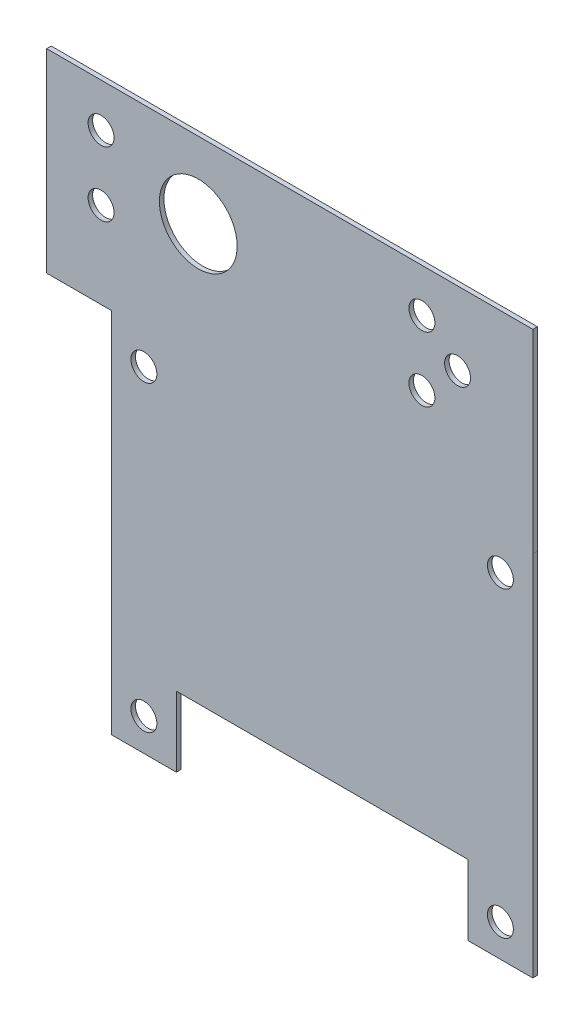
ISO-10303-21;
HEADER;
FILE_DESCRIPTION(('STEP AP214'),'2;1');
FILE_NAME('part.step','',(''),(''),'','','');
FILE_SCHEMA(('AUTOMOTIVE_DESIGN { 1 0 10303 214 1 1 1 1 }'));
ENDSEC;
DATA;
#1=APPLICATION_CONTEXT('core data for automotive mechanical design processes');
#2=APPLICATION_PROTOCOL_DEFINITION('international standard','automotive_design',2000,#1);
#3=PRODUCT_CONTEXT('',#1,'mechanical');
#4=PRODUCT('Part','Part','',(#3));
#5=PRODUCT_RELATED_PRODUCT_CATEGORY('part','',(#4));
#6=PRODUCT_DEFINITION_FORMATION('','',#4);
#7=PRODUCT_DEFINITION_CONTEXT('part definition',#1,'design');
#8=PRODUCT_DEFINITION('design','',#6,#7);
#9=PRODUCT_DEFINITION_SHAPE('','',#8);
#10=(LENGTH_UNIT() NAMED_UNIT(*) SI_UNIT(.MILLI.,.METRE.));
#11=(NAMED_UNIT(*) PLANE_ANGLE_UNIT() SI_UNIT($,.RADIAN.));
#12=(NAMED_UNIT(*) SI_UNIT($,.STERADIAN.) SOLID_ANGLE_UNIT());
#13=UNCERTAINTY_MEASURE_WITH_UNIT(LENGTH_MEASURE(1.E-05),#10,'distance_accuracy_value','');
#14=(GEOMETRIC_REPRESENTATION_CONTEXT(3) GLOBAL_UNCERTAINTY_ASSIGNED_CONTEXT((#13)) GLOBAL_UNIT_ASSIGNED_CONTEXT((#10,
#11,#12)) REPRESENTATION_CONTEXT('',''));
#15=CARTESIAN_POINT('',(0.,0.,0.));
#16=DIRECTION('',(0.,0.,1.));
#17=DIRECTION('',(1.,0.,0.));
#18=AXIS2_PLACEMENT_3D('',#15,#16,#17);
#19=CARTESIAN_POINT('',(-32.5,-17.5,-0.7));
#20=DIRECTION('',(0.,-1.,0.));
#21=DIRECTION('',(1.,0.,0.));
#22=AXIS2_PLACEMENT_3D('',#19,#20,#21);
#23=PLANE('',#22);
#24=DIRECTION('',(1.,0.,0.));
#25=VECTOR('',#24,1.);
#26=CARTESIAN_POINT('',(-32.5,-17.5,0.));
#27=LINE('',#26,#25);
#28=CARTESIAN_POINT('',(-22.5,-17.5,0.));
#29=VERTEX_POINT('',#28);
#30=CARTESIAN_POINT('',(22.5,-17.5,0.));
#31=VERTEX_POINT('',#30);
#32=EDGE_CURVE('E173',#29,#31,#27,.T.);
#33=ORIENTED_EDGE('',*,*,#32,.F.);
#34=DIRECTION('',(0.,0.,-1.));
#35=VECTOR('',#34,1.);
#36=CARTESIAN_POINT('',(-22.5,-17.5,0.));
#37=LINE('',#36,#35);
#38=CARTESIAN_POINT('',(-22.5,-17.5,-0.7));
#39=VERTEX_POINT('',#38);
#40=EDGE_CURVE('E467',#29,#39,#37,.T.);
#41=ORIENTED_EDGE('',*,*,#40,.T.);
#42=DIRECTION('',(1.,0.,0.));
#43=VECTOR('',#42,1.);
#44=CARTESIAN_POINT('',(-32.5,-17.5,-0.7));
#45=LINE('',#44,#43);
#46=CARTESIAN_POINT('',(22.5,-17.5,-0.700000000000002));
#47=VERTEX_POINT('',#46);
#48=EDGE_CURVE('E286',#39,#47,#45,.T.);
#49=ORIENTED_EDGE('',*,*,#48,.T.);
#50=DIRECTION('',(0.,0.,-1.));
#51=VECTOR('',#50,1.);
#52=CARTESIAN_POINT('',(22.5,-17.5,0.));
#53=LINE('',#52,#51);
#54=EDGE_CURVE('E471',#31,#47,#53,.T.);
#55=ORIENTED_EDGE('',*,*,#54,.F.);
#56=EDGE_LOOP('',(#33,#41,#49,#55));
#57=FACE_BOUND('',#56,.T.);
#58=ADVANCED_FACE('F151',(#57),#23,.T.);
#59=CARTESIAN_POINT('',(-32.5,17.5,-0.7));
#60=DIRECTION('',(-1.,0.,0.));
#61=DIRECTION('',(0.,0.,1.));
#62=AXIS2_PLACEMENT_3D('',#59,#60,#61);
#63=PLANE('',#62);
#64=DIRECTION('',(0.,-1.,0.));
#65=VECTOR('',#64,1.);
#66=CARTESIAN_POINT('',(-32.5,17.5,0.));
#67=LINE('',#66,#65);
#68=CARTESIAN_POINT('',(-32.5,28.3351768777757,0.));
#69=VERTEX_POINT('',#68);
#70=CARTESIAN_POINT('',(-32.5,-28.3351768777757,0.));
#71=VERTEX_POINT('',#70);
#72=EDGE_CURVE('E276',#69,#71,#67,.T.);
#73=ORIENTED_EDGE('',*,*,#72,.F.);
#74=DIRECTION('',(0.,0.,1.));
#75=VECTOR('',#74,1.);
#76=CARTESIAN_POINT('',(-32.5,28.3351768777757,-0.700000000000062));
#77=LINE('',#76,#75);
#78=CARTESIAN_POINT('',(-32.5,28.3351768777757,-0.700000000000062));
#79=VERTEX_POINT('',#78);
#80=EDGE_CURVE('E279',#79,#69,#77,.T.);
#81=ORIENTED_EDGE('',*,*,#80,.F.);
#82=DIRECTION('',(0.,-1.,0.));
#83=VECTOR('',#82,1.);
#84=CARTESIAN_POINT('',(-32.5,17.5,-0.7));
#85=LINE('',#84,#83);
#86=CARTESIAN_POINT('',(-32.5,-28.3351768777757,-0.700000000000062));
#87=VERTEX_POINT('',#86);
#88=EDGE_CURVE('E465',#79,#87,#85,.T.);
#89=ORIENTED_EDGE('',*,*,#88,.T.);
#90=DIRECTION('',(0.,0.,1.));
#91=VECTOR('',#90,1.);
#92=CARTESIAN_POINT('',(-32.5,-28.3351768777757,-0.700000000000062));
#93=LINE('',#92,#91);
#94=EDGE_CURVE('E282',#87,#71,#93,.T.);
#95=ORIENTED_EDGE('',*,*,#94,.T.);
#96=EDGE_LOOP('',(#73,#81,#89,#95));
#97=FACE_BOUND('',#96,.T.);
#98=ADVANCED_FACE('F278',(#97),#63,.T.);
#99=CARTESIAN_POINT('',(32.5,17.5,-0.7));
#100=DIRECTION('',(-1.,0.,0.));
#101=DIRECTION('',(0.,0.,1.));
#102=AXIS2_PLACEMENT_3D('',#99,#100,#101);
#103=PLANE('',#102);
#104=DIRECTION('',(0.,-1.,0.));
#105=VECTOR('',#104,1.);
#106=CARTESIAN_POINT('',(32.5,17.5,0.));
#107=LINE('',#106,#105);
#108=CARTESIAN_POINT('',(32.5,28.3351768777757,0.));
#109=VERTEX_POINT('',#108);
#110=CARTESIAN_POINT('',(32.5,-28.3351768777757,0.));
#111=VERTEX_POINT('',#110);
#112=EDGE_CURVE('E287',#109,#111,#107,.T.);
#113=ORIENTED_EDGE('',*,*,#112,.T.);
#114=DIRECTION('',(0.,0.,1.));
#115=VECTOR('',#114,1.);
#116=CARTESIAN_POINT('',(32.5,-28.3351768777757,-0.700000000000062));
#117=LINE('',#116,#115);
#118=CARTESIAN_POINT('',(32.5,-28.3351768777757,-0.700000000000062));
#119=VERTEX_POINT('',#118);
#120=EDGE_CURVE('E346',#119,#111,#117,.T.);
#121=ORIENTED_EDGE('',*,*,#120,.F.);
#122=DIRECTION('',(0.,-1.,0.));
#123=VECTOR('',#122,1.);
#124=CARTESIAN_POINT('',(32.5,17.5,-0.7));
#125=LINE('',#124,#123);
#126=CARTESIAN_POINT('',(32.5,28.3351768777757,-0.700000000000062));
#127=VERTEX_POINT('',#126);
#128=EDGE_CURVE('E463',#127,#119,#125,.T.);
#129=ORIENTED_EDGE('',*,*,#128,.F.);
#130=DIRECTION('',(0.,0.,1.));
#131=VECTOR('',#130,1.);
#132=CARTESIAN_POINT('',(32.5,28.3351768777757,-0.700000000000062));
#133=LINE('',#132,#131);
#134=EDGE_CURVE('E311',#127,#109,#133,.T.);
#135=ORIENTED_EDGE('',*,*,#134,.T.);
#136=EDGE_LOOP('',(#113,#121,#129,#135));
#137=FACE_BOUND('',#136,.T.);
#138=ADVANCED_FACE('F531',(#137),#103,.F.);
#139=CARTESIAN_POINT('',(0.,0.,-0.7));
#140=DIRECTION('',(0.,0.,-1.));
#141=DIRECTION('',(-1.,0.,0.));
#142=AXIS2_PLACEMENT_3D('',#139,#140,#141);
#143=PLANE('',#142);
#144=ORIENTED_EDGE('',*,*,#48,.F.);
#145=DIRECTION('',(0.,1.,0.));
#146=VECTOR('',#145,1.);
#147=CARTESIAN_POINT('',(-22.5,-18.1675884388878,-0.7));
#148=LINE('',#147,#146);
#149=CARTESIAN_POINT('',(-22.5,-28.3351768777757,-0.700000000000062));
#150=VERTEX_POINT('',#149);
#151=EDGE_CURVE('E372',#39,#150,#148,.F.);
#152=ORIENTED_EDGE('',*,*,#151,.T.);
#153=DIRECTION('',(-1.,0.,0.));
#154=VECTOR('',#153,1.);
#155=CARTESIAN_POINT('',(-22.5,-28.3351768777757,-0.700000000000062));
#156=LINE('',#155,#154);
#157=EDGE_CURVE('E354',#87,#150,#156,.F.);
#158=ORIENTED_EDGE('',*,*,#157,.F.);
#159=ORIENTED_EDGE('',*,*,#88,.F.);
#160=DIRECTION('',(1.,0.,0.));
#161=VECTOR('',#160,1.);
#162=CARTESIAN_POINT('',(0.,28.3351768777757,-0.700000000000062));
#163=LINE('',#162,#161);
#164=CARTESIAN_POINT('',(-22.5,28.3351768777757,-0.700000000000062));
#165=VERTEX_POINT('',#164);
#166=EDGE_CURVE('E296',#79,#165,#163,.T.);
#167=ORIENTED_EDGE('',*,*,#166,.T.);
#168=DIRECTION('',(0.,1.,0.));
#169=VECTOR('',#168,1.);
#170=CARTESIAN_POINT('',(-22.5,18.1675884388878,-0.7));
#171=LINE('',#170,#169);
#172=CARTESIAN_POINT('',(-22.5,17.5,-0.7));
#173=VERTEX_POINT('',#172);
#174=EDGE_CURVE('E305',#165,#173,#171,.F.);
#175=ORIENTED_EDGE('',*,*,#174,.T.);
#176=DIRECTION('',(0.,1.,0.));
#177=VECTOR('',#176,1.);
#178=CARTESIAN_POINT('',(-22.5,18.1675884388878,-0.7));
#179=LINE('',#178,#177);
#180=CARTESIAN_POINT('',(-22.5,28.3351768777757,-0.699999999999937));
#181=VERTEX_POINT('',#180);
#182=EDGE_CURVE('E454',#173,#181,#179,.T.);
#183=ORIENTED_EDGE('',*,*,#182,.T.);
#184=DIRECTION('',(1.,0.,0.));
#185=VECTOR('',#184,1.);
#186=CARTESIAN_POINT('',(-22.5,28.3351768777757,-0.699999999999937));
#187=LINE('',#186,#185);
#188=CARTESIAN_POINT('',(-42.5,28.3351768777757,-0.699999999999937));
#189=VERTEX_POINT('',#188);
#190=EDGE_CURVE('E422',#189,#181,#187,.T.);
#191=ORIENTED_EDGE('',*,*,#190,.F.);
#192=DIRECTION('',(0.,-1.,0.));
#193=VECTOR('',#192,1.);
#194=CARTESIAN_POINT('',(-42.5,58.3351768777757,-0.699999999999729));
#195=LINE('',#194,#193);
#196=CARTESIAN_POINT('',(-42.5,58.3351768777757,-0.699999999999729));
#197=VERTEX_POINT('',#196);
#198=EDGE_CURVE('E427',#197,#189,#195,.T.);
#199=ORIENTED_EDGE('',*,*,#198,.F.);
#200=DIRECTION('',(1.,0.,0.));
#201=VECTOR('',#200,1.);
#202=CARTESIAN_POINT('',(-22.5,58.3351768777757,-0.699999999999729));
#203=LINE('',#202,#201);
#204=CARTESIAN_POINT('',(32.5,58.3351768777757,-0.699999999999729));
#205=VERTEX_POINT('',#204);
#206=EDGE_CURVE('E436',#205,#197,#203,.F.);
#207=ORIENTED_EDGE('',*,*,#206,.F.);
#208=DIRECTION('',(0.,-1.,0.));
#209=VECTOR('',#208,1.);
#210=CARTESIAN_POINT('',(32.5,58.3351768777757,-0.699999999999729));
#211=LINE('',#210,#209);
#212=CARTESIAN_POINT('',(32.5,28.3351768777757,-0.699999999999937));
#213=VERTEX_POINT('',#212);
#214=EDGE_CURVE('E398',#205,#213,#211,.T.);
#215=ORIENTED_EDGE('',*,*,#214,.T.);
#216=DIRECTION('',(-1.,0.,0.));
#217=VECTOR('',#216,1.);
#218=CARTESIAN_POINT('',(22.5,28.3351768777757,-0.699999999999937));
#219=LINE('',#218,#217);
#220=CARTESIAN_POINT('',(22.5,28.3351768777757,-0.699999999999937));
#221=VERTEX_POINT('',#220);
#222=EDGE_CURVE('E395',#213,#221,#219,.T.);
#223=ORIENTED_EDGE('',*,*,#222,.T.);
#224=DIRECTION('',(0.,1.,0.));
#225=VECTOR('',#224,1.);
#226=CARTESIAN_POINT('',(22.5,18.1675884388878,-0.7));
#227=LINE('',#226,#225);
#228=CARTESIAN_POINT('',(22.5,17.5,-0.700000000000002));
#229=VERTEX_POINT('',#228);
#230=EDGE_CURVE('E456',#221,#229,#227,.F.);
#231=ORIENTED_EDGE('',*,*,#230,.T.);
#232=DIRECTION('',(0.,1.,0.));
#233=VECTOR('',#232,1.);
#234=CARTESIAN_POINT('',(22.5,18.1675884388878,-0.700000000000002));
#235=LINE('',#234,#233);
#236=CARTESIAN_POINT('',(22.5,28.3351768777757,-0.700000000000062));
#237=VERTEX_POINT('',#236);
#238=EDGE_CURVE('E329',#229,#237,#235,.T.);
#239=ORIENTED_EDGE('',*,*,#238,.T.);
#240=DIRECTION('',(1.,0.,0.));
#241=VECTOR('',#240,1.);
#242=CARTESIAN_POINT('',(22.5,28.3351768777757,-0.700000000000062));
#243=LINE('',#242,#241);
#244=EDGE_CURVE('E308',#127,#237,#243,.F.);
#245=ORIENTED_EDGE('',*,*,#244,.F.);
#246=ORIENTED_EDGE('',*,*,#128,.T.);
#247=DIRECTION('',(-1.,0.,0.));
#248=VECTOR('',#247,1.);
#249=CARTESIAN_POINT('',(0.,-28.3351768777757,-0.700000000000062));
#250=LINE('',#249,#248);
#251=CARTESIAN_POINT('',(22.5,-28.3351768777757,-0.700000000000062));
#252=VERTEX_POINT('',#251);
#253=EDGE_CURVE('E337',#119,#252,#250,.T.);
#254=ORIENTED_EDGE('',*,*,#253,.T.);
#255=DIRECTION('',(0.,1.,0.));
#256=VECTOR('',#255,1.);
#257=CARTESIAN_POINT('',(22.5,-18.1675884388878,-0.700000000000002));
#258=LINE('',#257,#256);
#259=EDGE_CURVE('E351',#252,#47,#258,.T.);
#260=ORIENTED_EDGE('',*,*,#259,.T.);
#261=EDGE_LOOP('',(#144,#152,#158,#159,#167,#175,#183,#191,#199,#207,#215,#223,#231,#239,#245,
#246,#254,#260));
#262=FACE_BOUND('',#261,.T.);
#263=CARTESIAN_POINT('',(20.8904963417452,47.0054323524082,-0.699999999999808));
#264=DIRECTION('',(0.,0.,-1.));
#265=DIRECTION('',(0.,1.,0.));
#266=AXIS2_PLACEMENT_3D('',#263,#264,#265);
#267=CIRCLE('',#266,2.);
#268=CARTESIAN_POINT('',(20.8904963417452,45.0054323524082,-0.699999999999823));
#269=VERTEX_POINT('',#268);
#270=EDGE_CURVE('E404',#269,#269,#267,.F.);
#271=ORIENTED_EDGE('',*,*,#270,.T.);
#272=EDGE_LOOP('',(#271));
#273=FACE_BOUND('',#272,.T.);
#274=CARTESIAN_POINT('',(15.392410617428,51.6141033474119,-0.699999999999777));
#275=DIRECTION('',(0.,0.,-1.));
#276=DIRECTION('',(0.,1.,0.));
#277=AXIS2_PLACEMENT_3D('',#274,#275,#276);
#278=CIRCLE('',#277,2.);
#279=CARTESIAN_POINT('',(15.392410617428,53.6141033474119,-0.699999999999763));
#280=VERTEX_POINT('',#279);
#281=EDGE_CURVE('E410',#280,#280,#278,.T.);
#282=ORIENTED_EDGE('',*,*,#281,.F.);
#283=EDGE_LOOP('',(#282));
#284=FACE_BOUND('',#283,.T.);
#285=CARTESIAN_POINT('',(-34.107589382572,51.6141033474119,-0.699999999999777));
#286=DIRECTION('',(0.,0.,-1.));
#287=DIRECTION('',(0.,1.,0.));
#288=AXIS2_PLACEMENT_3D('',#285,#286,#287);
#289=CIRCLE('',#288,2.);
#290=CARTESIAN_POINT('',(-34.107589382572,53.6141033474119,-0.699999999999763));
#291=VERTEX_POINT('',#290);
#292=EDGE_CURVE('E413',#291,#291,#289,.T.);
#293=ORIENTED_EDGE('',*,*,#292,.F.);
#294=EDGE_LOOP('',(#293));
#295=FACE_BOUND('',#294,.T.);
#296=CARTESIAN_POINT('',(-19.107589382572,46.6141033474119,-0.699999999999812));
#297=DIRECTION('',(0.,0.,-1.));
#298=DIRECTION('',(0.,1.,0.));
#299=AXIS2_PLACEMENT_3D('',#296,#297,#298);
#300=CIRCLE('',#299,6.);
#301=CARTESIAN_POINT('',(-19.107589382572,52.6141033474119,-0.69999999999977));
#302=VERTEX_POINT('',#301);
#303=EDGE_CURVE('E401',#302,#302,#300,.F.);
#304=ORIENTED_EDGE('',*,*,#303,.T.);
#305=EDGE_LOOP('',(#304));
#306=FACE_BOUND('',#305,.T.);
#307=CARTESIAN_POINT('',(15.392410617428,41.6141033474119,-0.699999999999847));
#308=DIRECTION('',(0.,0.,-1.));
#309=DIRECTION('',(0.,1.,0.));
#310=AXIS2_PLACEMENT_3D('',#307,#308,#309);
#311=CIRCLE('',#310,2.00000000000001);
#312=CARTESIAN_POINT('',(15.392410617428,43.6141033474119,-0.699999999999833));
#313=VERTEX_POINT('',#312);
#314=EDGE_CURVE('E392',#313,#313,#311,.F.);
#315=ORIENTED_EDGE('',*,*,#314,.T.);
#316=EDGE_LOOP('',(#315));
#317=FACE_BOUND('',#316,.T.);
#318=CARTESIAN_POINT('',(-34.107589382572,41.6141033474119,-0.699999999999847));
#319=DIRECTION('',(0.,0.,-1.));
#320=DIRECTION('',(0.,1.,0.));
#321=AXIS2_PLACEMENT_3D('',#318,#319,#320);
#322=CIRCLE('',#321,2.);
#323=CARTESIAN_POINT('',(-34.107589382572,43.6141033474119,-0.699999999999833));
#324=VERTEX_POINT('',#323);
#325=EDGE_CURVE('E389',#324,#324,#322,.F.);
#326=ORIENTED_EDGE('',*,*,#325,.T.);
#327=EDGE_LOOP('',(#326));
#328=FACE_BOUND('',#327,.T.);
#329=CARTESIAN_POINT('',(-27.5,-23.3351768777757,-0.700000000000027));
#330=DIRECTION('',(0.,0.,1.));
#331=DIRECTION('',(0.,-1.,0.));
#332=AXIS2_PLACEMENT_3D('',#329,#330,#331);
#333=CIRCLE('',#332,2.);
#334=CARTESIAN_POINT('',(-27.5,-25.3351768777757,-0.700000000000041));
#335=VERTEX_POINT('',#334);
#336=EDGE_CURVE('E364',#335,#335,#333,.T.);
#337=ORIENTED_EDGE('',*,*,#336,.T.);
#338=EDGE_LOOP('',(#337));
#339=FACE_BOUND('',#338,.T.);
#340=CARTESIAN_POINT('',(27.5,-23.3351768777757,-0.700000000000027));
#341=DIRECTION('',(0.,0.,1.));
#342=DIRECTION('',(0.,-1.,0.));
#343=AXIS2_PLACEMENT_3D('',#340,#341,#342);
#344=CIRCLE('',#343,2.);
#345=CARTESIAN_POINT('',(27.5,-25.3351768777757,-0.700000000000041));
#346=VERTEX_POINT('',#345);
#347=EDGE_CURVE('E343',#346,#346,#344,.F.);
#348=ORIENTED_EDGE('',*,*,#347,.F.);
#349=EDGE_LOOP('',(#348));
#350=FACE_BOUND('',#349,.T.);
#351=CARTESIAN_POINT('',(27.5,23.3351768777757,-0.700000000000027));
#352=DIRECTION('',(0.,0.,1.));
#353=DIRECTION('',(0.,-1.,0.));
#354=AXIS2_PLACEMENT_3D('',#351,#352,#353);
#355=CIRCLE('',#354,2.);
#356=CARTESIAN_POINT('',(27.5,21.3351768777757,-0.700000000000013));
#357=VERTEX_POINT('',#356);
#358=EDGE_CURVE('E321',#357,#357,#355,.T.);
#359=ORIENTED_EDGE('',*,*,#358,.T.);
#360=EDGE_LOOP('',(#359));
#361=FACE_BOUND('',#360,.T.);
#362=CARTESIAN_POINT('',(-27.5,23.3351768777757,-0.700000000000027));
#363=DIRECTION('',(0.,0.,1.));
#364=DIRECTION('',(0.,-1.,0.));
#365=AXIS2_PLACEMENT_3D('',#362,#363,#364);
#366=CIRCLE('',#365,2.);
#367=CARTESIAN_POINT('',(-27.5,21.3351768777757,-0.700000000000013));
#368=VERTEX_POINT('',#367);
#369=EDGE_CURVE('E297',#368,#368,#366,.F.);
#370=ORIENTED_EDGE('',*,*,#369,.F.);
#371=EDGE_LOOP('',(#370));
#372=FACE_BOUND('',#371,.T.);
#373=ADVANCED_FACE('F492',(#262,#273,#284,#295,#306,#317,#328,#339,#350,#361,#372),#143,.T.);
#374=CARTESIAN_POINT('',(0.,0.,0.));
#375=DIRECTION('',(0.,0.,-1.));
#376=DIRECTION('',(-1.,0.,0.));
#377=AXIS2_PLACEMENT_3D('',#374,#375,#376);
#378=PLANE('',#377);
#379=ORIENTED_EDGE('',*,*,#72,.T.);
#380=DIRECTION('',(1.,0.,0.));
#381=VECTOR('',#380,1.);
#382=CARTESIAN_POINT('',(0.,-28.3351768777757,0.));
#383=LINE('',#382,#381);
#384=CARTESIAN_POINT('',(-22.5,-28.3351768777757,0.));
#385=VERTEX_POINT('',#384);
#386=EDGE_CURVE('E359',#71,#385,#383,.T.);
#387=ORIENTED_EDGE('',*,*,#386,.T.);
#388=DIRECTION('',(0.,1.,0.));
#389=VECTOR('',#388,1.);
#390=CARTESIAN_POINT('',(-22.5,-18.1675884388878,0.));
#391=LINE('',#390,#389);
#392=EDGE_CURVE('E358',#29,#385,#391,.F.);
#393=ORIENTED_EDGE('',*,*,#392,.F.);
#394=ORIENTED_EDGE('',*,*,#32,.T.);
#395=DIRECTION('',(0.,1.,0.));
#396=VECTOR('',#395,1.);
#397=CARTESIAN_POINT('',(22.5,-18.1675884388878,0.));
#398=LINE('',#397,#396);
#399=CARTESIAN_POINT('',(22.5,-28.3351768777757,0.));
#400=VERTEX_POINT('',#399);
#401=EDGE_CURVE('E336',#400,#31,#398,.T.);
#402=ORIENTED_EDGE('',*,*,#401,.F.);
#403=DIRECTION('',(1.,0.,0.));
#404=VECTOR('',#403,1.);
#405=CARTESIAN_POINT('',(22.5,-28.3351768777757,0.));
#406=LINE('',#405,#404);
#407=EDGE_CURVE('E331',#111,#400,#406,.F.);
#408=ORIENTED_EDGE('',*,*,#407,.F.);
#409=ORIENTED_EDGE('',*,*,#112,.F.);
#410=DIRECTION('',(-1.,0.,0.));
#411=VECTOR('',#410,1.);
#412=CARTESIAN_POINT('',(0.,28.3351768777757,0.));
#413=LINE('',#412,#411);
#414=CARTESIAN_POINT('',(22.5,28.3351768777757,0.));
#415=VERTEX_POINT('',#414);
#416=EDGE_CURVE('E315',#109,#415,#413,.T.);
#417=ORIENTED_EDGE('',*,*,#416,.T.);
#418=DIRECTION('',(0.,1.,0.));
#419=VECTOR('',#418,1.);
#420=CARTESIAN_POINT('',(22.5,18.1675884388878,0.));
#421=LINE('',#420,#419);
#422=CARTESIAN_POINT('',(22.5,17.5,0.));
#423=VERTEX_POINT('',#422);
#424=EDGE_CURVE('E314',#423,#415,#421,.T.);
#425=ORIENTED_EDGE('',*,*,#424,.F.);
#426=DIRECTION('',(0.,1.,0.));
#427=VECTOR('',#426,1.);
#428=CARTESIAN_POINT('',(22.5,18.1675884388878,0.));
#429=LINE('',#428,#427);
#430=CARTESIAN_POINT('',(22.5,28.3351768777757,0.));
#431=VERTEX_POINT('',#430);
#432=EDGE_CURVE('E457',#431,#423,#429,.F.);
#433=ORIENTED_EDGE('',*,*,#432,.F.);
#434=DIRECTION('',(-1.,0.,0.));
#435=VECTOR('',#434,1.);
#436=CARTESIAN_POINT('',(22.5,28.3351768777757,0.));
#437=LINE('',#436,#435);
#438=CARTESIAN_POINT('',(32.5,28.3351768777757,0.));
#439=VERTEX_POINT('',#438);
#440=EDGE_CURVE('E446',#439,#431,#437,.T.);
#441=ORIENTED_EDGE('',*,*,#440,.F.);
#442=DIRECTION('',(0.,-1.,0.));
#443=VECTOR('',#442,1.);
#444=CARTESIAN_POINT('',(32.5,58.3351768777757,2.70616862252382E-13));
#445=LINE('',#444,#443);
#446=CARTESIAN_POINT('',(32.5,58.3351768777757,2.70616862252382E-13));
#447=VERTEX_POINT('',#446);
#448=EDGE_CURVE('E440',#447,#439,#445,.T.);
#449=ORIENTED_EDGE('',*,*,#448,.F.);
#450=DIRECTION('',(-1.,0.,0.));
#451=VECTOR('',#450,1.);
#452=CARTESIAN_POINT('',(0.,58.3351768777757,2.70616862252382E-13));
#453=LINE('',#452,#451);
#454=CARTESIAN_POINT('',(-42.5,58.3351768777757,2.70616862252382E-13));
#455=VERTEX_POINT('',#454);
#456=EDGE_CURVE('E384',#447,#455,#453,.T.);
#457=ORIENTED_EDGE('',*,*,#456,.T.);
#458=DIRECTION('',(0.,-1.,0.));
#459=VECTOR('',#458,1.);
#460=CARTESIAN_POINT('',(-42.5,58.3351768777757,2.70616862252382E-13));
#461=LINE('',#460,#459);
#462=CARTESIAN_POINT('',(-42.5,28.3351768777757,0.));
#463=VERTEX_POINT('',#462);
#464=EDGE_CURVE('E381',#455,#463,#461,.T.);
#465=ORIENTED_EDGE('',*,*,#464,.T.);
#466=DIRECTION('',(1.,0.,0.));
#467=VECTOR('',#466,1.);
#468=CARTESIAN_POINT('',(-22.5,28.3351768777757,0.));
#469=LINE('',#468,#467);
#470=CARTESIAN_POINT('',(-22.5,28.3351768777757,0.));
#471=VERTEX_POINT('',#470);
#472=EDGE_CURVE('E379',#463,#471,#469,.T.);
#473=ORIENTED_EDGE('',*,*,#472,.T.);
#474=DIRECTION('',(0.,1.,0.));
#475=VECTOR('',#474,1.);
#476=CARTESIAN_POINT('',(-22.5,18.1675884388878,0.));
#477=LINE('',#476,#475);
#478=CARTESIAN_POINT('',(-22.5,17.5,0.));
#479=VERTEX_POINT('',#478);
#480=EDGE_CURVE('E166',#479,#471,#477,.T.);
#481=ORIENTED_EDGE('',*,*,#480,.F.);
#482=DIRECTION('',(0.,1.,0.));
#483=VECTOR('',#482,1.);
#484=CARTESIAN_POINT('',(-22.5,18.1675884388878,0.));
#485=LINE('',#484,#483);
#486=CARTESIAN_POINT('',(-22.5,28.3351768777757,0.));
#487=VERTEX_POINT('',#486);
#488=EDGE_CURVE('E301',#487,#479,#485,.F.);
#489=ORIENTED_EDGE('',*,*,#488,.F.);
#490=DIRECTION('',(-1.,0.,0.));
#491=VECTOR('',#490,1.);
#492=CARTESIAN_POINT('',(-22.5,28.3351768777757,0.));
#493=LINE('',#492,#491);
#494=EDGE_CURVE('E293',#69,#487,#493,.F.);
#495=ORIENTED_EDGE('',*,*,#494,.F.);
#496=EDGE_LOOP('',(#379,#387,#393,#394,#402,#408,#409,#417,#425,#433,#441,#449,#457,#465,#473,
#481,#489,#495));
#497=FACE_BOUND('',#496,.T.);
#498=CARTESIAN_POINT('',(20.8904963417452,47.0054323524082,1.90819582357449E-13));
#499=DIRECTION('',(0.,0.,1.));
#500=DIRECTION('',(0.,-1.,0.));
#501=AXIS2_PLACEMENT_3D('',#498,#499,#500);
#502=CIRCLE('',#501,2.);
#503=CARTESIAN_POINT('',(20.8904963417452,45.0054323524082,1.76074432811646E-13));
#504=VERTEX_POINT('',#503);
#505=EDGE_CURVE('E407',#504,#504,#502,.T.);
#506=ORIENTED_EDGE('',*,*,#505,.F.);
#507=EDGE_LOOP('',(#506));
#508=FACE_BOUND('',#507,.T.);
#509=CARTESIAN_POINT('',(15.392410617428,41.6141033474119,1.52655665885959E-13));
#510=DIRECTION('',(0.,0.,1.));
#511=DIRECTION('',(0.,-1.,0.));
#512=AXIS2_PLACEMENT_3D('',#509,#510,#511);
#513=CIRCLE('',#512,2.00000000000001);
#514=CARTESIAN_POINT('',(15.392410617428,39.6141033474119,1.38741557750584E-13));
#515=VERTEX_POINT('',#514);
#516=EDGE_CURVE('E449',#515,#515,#513,.T.);
#517=ORIENTED_EDGE('',*,*,#516,.F.);
#518=EDGE_LOOP('',(#517));
#519=FACE_BOUND('',#518,.T.);
#520=CARTESIAN_POINT('',(-34.107589382572,51.6141033474119,2.22044604925031E-13));
#521=DIRECTION('',(0.,0.,1.));
#522=DIRECTION('',(0.,-1.,0.));
#523=AXIS2_PLACEMENT_3D('',#520,#521,#522);
#524=CIRCLE('',#523,2.);
#525=CARTESIAN_POINT('',(-34.107589382572,49.6141033474119,2.08130496789656E-13));
#526=VERTEX_POINT('',#525);
#527=EDGE_CURVE('E386',#526,#526,#524,.F.);
#528=ORIENTED_EDGE('',*,*,#527,.T.);
#529=EDGE_LOOP('',(#528));
#530=FACE_BOUND('',#529,.T.);
#531=CARTESIAN_POINT('',(-19.107589382572,46.6141033474119,1.87350135405495E-13));
#532=DIRECTION('',(0.,0.,1.));
#533=DIRECTION('',(0.,-1.,0.));
#534=AXIS2_PLACEMENT_3D('',#531,#532,#533);
#535=CIRCLE('',#534,6.);
#536=CARTESIAN_POINT('',(-19.107589382572,40.6141033474119,1.45584565660715E-13));
#537=VERTEX_POINT('',#536);
#538=EDGE_CURVE('E416',#537,#537,#535,.T.);
#539=ORIENTED_EDGE('',*,*,#538,.F.);
#540=EDGE_LOOP('',(#539));
#541=FACE_BOUND('',#540,.T.);
#542=CARTESIAN_POINT('',(15.392410617428,51.6141033474119,2.22044604925031E-13));
#543=DIRECTION('',(0.,0.,1.));
#544=DIRECTION('',(0.,-1.,0.));
#545=AXIS2_PLACEMENT_3D('',#542,#543,#544);
#546=CIRCLE('',#545,2.);
#547=CARTESIAN_POINT('',(15.392410617428,49.6141033474119,2.08130496789656E-13));
#548=VERTEX_POINT('',#547);
#549=EDGE_CURVE('E376',#548,#548,#546,.F.);
#550=ORIENTED_EDGE('',*,*,#549,.T.);
#551=EDGE_LOOP('',(#550));
#552=FACE_BOUND('',#551,.T.);
#553=CARTESIAN_POINT('',(-34.107589382572,41.6141033474119,1.52655665885959E-13));
#554=DIRECTION('',(0.,0.,1.));
#555=DIRECTION('',(0.,-1.,0.));
#556=AXIS2_PLACEMENT_3D('',#553,#554,#555);
#557=CIRCLE('',#556,2.);
#558=CARTESIAN_POINT('',(-34.107589382572,39.6141033474119,1.38741557750584E-13));
#559=VERTEX_POINT('',#558);
#560=EDGE_CURVE('E374',#559,#559,#557,.T.);
#561=ORIENTED_EDGE('',*,*,#560,.F.);
#562=EDGE_LOOP('',(#561));
#563=FACE_BOUND('',#562,.T.);
#564=CARTESIAN_POINT('',(-27.5,-23.3351768777757,0.));
#565=DIRECTION('',(0.,0.,-1.));
#566=DIRECTION('',(0.,1.,0.));
#567=AXIS2_PLACEMENT_3D('',#564,#565,#566);
#568=CIRCLE('',#567,2.);
#569=CARTESIAN_POINT('',(-27.5,-21.3351768777757,0.));
#570=VERTEX_POINT('',#569);
#571=EDGE_CURVE('E361',#570,#570,#568,.T.);
#572=ORIENTED_EDGE('',*,*,#571,.T.);
#573=EDGE_LOOP('',(#572));
#574=FACE_BOUND('',#573,.T.);
#575=CARTESIAN_POINT('',(27.5,-23.3351768777757,0.));
#576=DIRECTION('',(0.,0.,1.));
#577=DIRECTION('',(0.,1.,0.));
#578=AXIS2_PLACEMENT_3D('',#575,#576,#577);
#579=CIRCLE('',#578,2.);
#580=CARTESIAN_POINT('',(27.5,-21.3351768777757,0.));
#581=VERTEX_POINT('',#580);
#582=EDGE_CURVE('E340',#581,#581,#579,.T.);
#583=ORIENTED_EDGE('',*,*,#582,.F.);
#584=EDGE_LOOP('',(#583));
#585=FACE_BOUND('',#584,.T.);
#586=CARTESIAN_POINT('',(27.5,23.3351768777757,0.));
#587=DIRECTION('',(0.,0.,-1.));
#588=DIRECTION('',(0.,-1.,0.));
#589=AXIS2_PLACEMENT_3D('',#586,#587,#588);
#590=CIRCLE('',#589,2.);
#591=CARTESIAN_POINT('',(27.5,21.3351768777757,0.));
#592=VERTEX_POINT('',#591);
#593=EDGE_CURVE('E318',#592,#592,#590,.T.);
#594=ORIENTED_EDGE('',*,*,#593,.T.);
#595=EDGE_LOOP('',(#594));
#596=FACE_BOUND('',#595,.T.);
#597=CARTESIAN_POINT('',(-27.5,23.3351768777757,0.));
#598=DIRECTION('',(0.,0.,1.));
#599=DIRECTION('',(0.,-1.,0.));
#600=AXIS2_PLACEMENT_3D('',#597,#598,#599);
#601=CIRCLE('',#600,2.);
#602=CARTESIAN_POINT('',(-27.5,21.3351768777757,0.));
#603=VERTEX_POINT('',#602);
#604=EDGE_CURVE('E520',#603,#603,#601,.T.);
#605=ORIENTED_EDGE('',*,*,#604,.F.);
#606=EDGE_LOOP('',(#605));
#607=FACE_BOUND('',#606,.T.);
#608=ADVANCED_FACE('F153',(#497,#508,#519,#530,#541,#552,#563,#574,#585,#596,#607),#378,.F.);
#609=CARTESIAN_POINT('',(-22.5,18.1675884388878,-0.35));
#610=DIRECTION('',(-1.,0.,0.));
#611=DIRECTION('',(0.,1.,0.));
#612=AXIS2_PLACEMENT_3D('',#609,#610,#611);
#613=PLANE('',#612);
#614=DIRECTION('',(0.,0.,-1.));
#615=VECTOR('',#614,1.);
#616=CARTESIAN_POINT('',(-22.5,17.5,0.));
#617=LINE('',#616,#615);
#618=EDGE_CURVE('E13',#479,#173,#617,.T.);
#619=ORIENTED_EDGE('',*,*,#618,.F.);
#620=ORIENTED_EDGE('',*,*,#480,.T.);
#621=DIRECTION('',(0.,0.,1.));
#622=VECTOR('',#621,1.);
#623=CARTESIAN_POINT('',(-22.5,28.3351768777757,-0.699999999999937));
#624=LINE('',#623,#622);
#625=EDGE_CURVE('E419',#181,#471,#624,.T.);
#626=ORIENTED_EDGE('',*,*,#625,.F.);
#627=ORIENTED_EDGE('',*,*,#182,.F.);
#628=EDGE_LOOP('',(#619,#620,#626,#627));
#629=FACE_BOUND('',#628,.T.);
#630=ADVANCED_FACE('F516',(#629),#613,.T.);
#631=CARTESIAN_POINT('',(22.5,18.1675884388878,-0.35));
#632=DIRECTION('',(-1.,0.,0.));
#633=DIRECTION('',(0.,1.,0.));
#634=AXIS2_PLACEMENT_3D('',#631,#632,#633);
#635=PLANE('',#634);
#636=ORIENTED_EDGE('',*,*,#432,.T.);
#637=DIRECTION('',(0.,0.,-1.));
#638=VECTOR('',#637,1.);
#639=CARTESIAN_POINT('',(22.5,17.5,0.));
#640=LINE('',#639,#638);
#641=EDGE_CURVE('E159',#423,#229,#640,.T.);
#642=ORIENTED_EDGE('',*,*,#641,.T.);
#643=ORIENTED_EDGE('',*,*,#230,.F.);
#644=DIRECTION('',(0.,0.,-1.));
#645=VECTOR('',#644,1.);
#646=CARTESIAN_POINT('',(22.5,28.3351768777757,0.));
#647=LINE('',#646,#645);
#648=EDGE_CURVE('E443',#431,#221,#647,.T.);
#649=ORIENTED_EDGE('',*,*,#648,.F.);
#650=EDGE_LOOP('',(#636,#642,#643,#649));
#651=FACE_BOUND('',#650,.T.);
#652=ADVANCED_FACE('F477',(#651),#635,.F.);
#653=CARTESIAN_POINT('',(-34.107589382572,41.6141033474119,-6.35685424949224));
#654=DIRECTION('',(0.,0.,1.));
#655=DIRECTION('',(0.,-1.,0.));
#656=AXIS2_PLACEMENT_3D('',#653,#654,#655);
#657=CYLINDRICAL_SURFACE('',#656,2.);
#658=ORIENTED_EDGE('',*,*,#560,.T.);
#659=EDGE_LOOP('',(#658));
#660=FACE_BOUND('',#659,.T.);
#661=ORIENTED_EDGE('',*,*,#325,.F.);
#662=EDGE_LOOP('',(#661));
#663=FACE_BOUND('',#662,.T.);
#664=ADVANCED_FACE('F572',(#660,#663),#657,.F.);
#665=CARTESIAN_POINT('',(15.392410617428,41.6141033474119,-6.35685424949224));
#666=DIRECTION('',(0.,0.,1.));
#667=DIRECTION('',(0.,-1.,0.));
#668=AXIS2_PLACEMENT_3D('',#665,#666,#667);
#669=CYLINDRICAL_SURFACE('',#668,2.00000000000001);
#670=ORIENTED_EDGE('',*,*,#516,.T.);
#671=EDGE_LOOP('',(#670));
#672=FACE_BOUND('',#671,.T.);
#673=ORIENTED_EDGE('',*,*,#314,.F.);
#674=EDGE_LOOP('',(#673));
#675=FACE_BOUND('',#674,.T.);
#676=ADVANCED_FACE('F575',(#672,#675),#669,.F.);
#677=CARTESIAN_POINT('',(22.5,28.3351768777757,0.));
#678=DIRECTION('',(0.,-1.,0.));
#679=DIRECTION('',(0.,0.,-1.));
#680=AXIS2_PLACEMENT_3D('',#677,#678,#679);
#681=PLANE('',#680);
#682=ORIENTED_EDGE('',*,*,#222,.F.);
#683=DIRECTION('',(0.,0.,-1.));
#684=VECTOR('',#683,1.);
#685=CARTESIAN_POINT('',(32.5,28.3351768777757,0.));
#686=LINE('',#685,#684);
#687=EDGE_CURVE('E438',#439,#213,#686,.T.);
#688=ORIENTED_EDGE('',*,*,#687,.F.);
#689=ORIENTED_EDGE('',*,*,#440,.T.);
#690=ORIENTED_EDGE('',*,*,#648,.T.);
#691=EDGE_LOOP('',(#682,#688,#689,#690));
#692=FACE_BOUND('',#691,.T.);
#693=ADVANCED_FACE('F498',(#692),#681,.T.);
#694=CARTESIAN_POINT('',(32.5,58.3351768777757,2.70616862252382E-13));
#695=DIRECTION('',(1.,0.,0.));
#696=DIRECTION('',(0.,0.,1.));
#697=AXIS2_PLACEMENT_3D('',#694,#695,#696);
#698=PLANE('',#697);
#699=ORIENTED_EDGE('',*,*,#214,.F.);
#700=DIRECTION('',(0.,0.,-1.));
#701=VECTOR('',#700,1.);
#702=CARTESIAN_POINT('',(32.5,58.3351768777757,2.70616862252382E-13));
#703=LINE('',#702,#701);
#704=EDGE_CURVE('E430',#447,#205,#703,.T.);
#705=ORIENTED_EDGE('',*,*,#704,.F.);
#706=ORIENTED_EDGE('',*,*,#448,.T.);
#707=ORIENTED_EDGE('',*,*,#687,.T.);
#708=EDGE_LOOP('',(#699,#705,#706,#707));
#709=FACE_BOUND('',#708,.T.);
#710=ADVANCED_FACE('F502',(#709),#698,.T.);
#711=CARTESIAN_POINT('',(-22.5,58.3351768777757,2.70616862252382E-13));
#712=DIRECTION('',(0.,-1.,0.));
#713=DIRECTION('',(0.,0.,-1.));
#714=AXIS2_PLACEMENT_3D('',#711,#712,#713);
#715=PLANE('',#714);
#716=ORIENTED_EDGE('',*,*,#206,.T.);
#717=DIRECTION('',(0.,0.,1.));
#718=VECTOR('',#717,1.);
#719=CARTESIAN_POINT('',(-42.5,58.3351768777757,-0.699999999999729));
#720=LINE('',#719,#718);
#721=EDGE_CURVE('E433',#197,#455,#720,.T.);
#722=ORIENTED_EDGE('',*,*,#721,.T.);
#723=ORIENTED_EDGE('',*,*,#456,.F.);
#724=ORIENTED_EDGE('',*,*,#704,.T.);
#725=EDGE_LOOP('',(#716,#722,#723,#724));
#726=FACE_BOUND('',#725,.T.);
#727=ADVANCED_FACE('F504',(#726),#715,.F.);
#728=CARTESIAN_POINT('',(-42.5,58.3351768777757,-0.699999999999729));
#729=DIRECTION('',(-1.,0.,0.));
#730=DIRECTION('',(0.,-1.,0.));
#731=AXIS2_PLACEMENT_3D('',#728,#729,#730);
#732=PLANE('',#731);
#733=ORIENTED_EDGE('',*,*,#464,.F.);
#734=ORIENTED_EDGE('',*,*,#721,.F.);
#735=ORIENTED_EDGE('',*,*,#198,.T.);
#736=DIRECTION('',(0.,0.,1.));
#737=VECTOR('',#736,1.);
#738=CARTESIAN_POINT('',(-42.5,28.3351768777757,-0.699999999999937));
#739=LINE('',#738,#737);
#740=EDGE_CURVE('E425',#189,#463,#739,.T.);
#741=ORIENTED_EDGE('',*,*,#740,.T.);
#742=EDGE_LOOP('',(#733,#734,#735,#741));
#743=FACE_BOUND('',#742,.T.);
#744=ADVANCED_FACE('F509',(#743),#732,.T.);
#745=CARTESIAN_POINT('',(-22.5,28.3351768777757,-0.699999999999937));
#746=DIRECTION('',(0.,-1.,0.));
#747=DIRECTION('',(0.,0.,-1.));
#748=AXIS2_PLACEMENT_3D('',#745,#746,#747);
#749=PLANE('',#748);
#750=ORIENTED_EDGE('',*,*,#472,.F.);
#751=ORIENTED_EDGE('',*,*,#740,.F.);
#752=ORIENTED_EDGE('',*,*,#190,.T.);
#753=ORIENTED_EDGE('',*,*,#625,.T.);
#754=EDGE_LOOP('',(#750,#751,#752,#753));
#755=FACE_BOUND('',#754,.T.);
#756=ADVANCED_FACE('F512',(#755),#749,.T.);
#757=CARTESIAN_POINT('',(-19.107589382572,46.614103347412,-17.6705627484769));
#758=DIRECTION('',(0.,0.,1.));
#759=DIRECTION('',(0.,-1.,0.));
#760=AXIS2_PLACEMENT_3D('',#757,#758,#759);
#761=CYLINDRICAL_SURFACE('',#760,6.);
#762=ORIENTED_EDGE('',*,*,#538,.T.);
#763=EDGE_LOOP('',(#762));
#764=FACE_BOUND('',#763,.T.);
#765=ORIENTED_EDGE('',*,*,#303,.F.);
#766=EDGE_LOOP('',(#765));
#767=FACE_BOUND('',#766,.T.);
#768=ADVANCED_FACE('F590',(#764,#767),#761,.F.);
#769=CARTESIAN_POINT('',(-34.107589382572,51.6141033474119,-6.35685424949218));
#770=DIRECTION('',(0.,0.,1.));
#771=DIRECTION('',(0.,-1.,0.));
#772=AXIS2_PLACEMENT_3D('',#769,#770,#771);
#773=CYLINDRICAL_SURFACE('',#772,2.);
#774=ORIENTED_EDGE('',*,*,#527,.F.);
#775=EDGE_LOOP('',(#774));
#776=FACE_BOUND('',#775,.T.);
#777=ORIENTED_EDGE('',*,*,#292,.T.);
#778=EDGE_LOOP('',(#777));
#779=FACE_BOUND('',#778,.T.);
#780=ADVANCED_FACE('F593',(#776,#779),#773,.F.);
#781=CARTESIAN_POINT('',(15.392410617428,51.6141033474119,-6.35685424949218));
#782=DIRECTION('',(0.,0.,1.));
#783=DIRECTION('',(0.,-1.,0.));
#784=AXIS2_PLACEMENT_3D('',#781,#782,#783);
#785=CYLINDRICAL_SURFACE('',#784,2.);
#786=ORIENTED_EDGE('',*,*,#549,.F.);
#787=EDGE_LOOP('',(#786));
#788=FACE_BOUND('',#787,.T.);
#789=ORIENTED_EDGE('',*,*,#281,.T.);
#790=EDGE_LOOP('',(#789));
#791=FACE_BOUND('',#790,.T.);
#792=ADVANCED_FACE('F597',(#788,#791),#785,.F.);
#793=CARTESIAN_POINT('',(20.8904963417452,47.0054323524082,-6.35685424949219));
#794=DIRECTION('',(0.,0.,1.));
#795=DIRECTION('',(0.,-1.,0.));
#796=AXIS2_PLACEMENT_3D('',#793,#794,#795);
#797=CYLINDRICAL_SURFACE('',#796,2.);
#798=CARTESIAN_POINT('',(20.8904963417452,45.0054323524082,1.76074432811646E-13));
#799=CARTESIAN_POINT('',(20.8904963417452,45.0054323524082,-0.00729166666649064));
#800=CARTESIAN_POINT('',(20.8904963417452,45.0054323524082,-0.0145833333331574));
#801=CARTESIAN_POINT('',(20.8904963417452,45.0054323524082,-0.0291666666664909));
#802=CARTESIAN_POINT('',(20.8904963417452,45.0054323524082,-0.0364583333331576));
#803=CARTESIAN_POINT('',(20.8904963417452,45.0054323524082,-0.0510416666664908));
#804=CARTESIAN_POINT('',(20.8904963417452,45.0054323524082,-0.0583333333331572));
#805=CARTESIAN_POINT('',(20.8904963417452,45.0054323524082,-0.0729166666664904));
#806=CARTESIAN_POINT('',(20.8904963417452,45.0054323524082,-0.0802083333331571));
#807=CARTESIAN_POINT('',(20.8904963417452,45.0054323524082,-0.0947916666664906));
#808=CARTESIAN_POINT('',(20.8904963417452,45.0054323524082,-0.102083333333157));
#809=CARTESIAN_POINT('',(20.8904963417452,45.0054323524082,-0.11666666666649));
#810=CARTESIAN_POINT('',(20.8904963417452,45.0054323524082,-0.123958333333157));
#811=CARTESIAN_POINT('',(20.8904963417452,45.0054323524082,-0.13854166666649));
#812=CARTESIAN_POINT('',(20.8904963417452,45.0054323524082,-0.145833333333157));
#813=CARTESIAN_POINT('',(20.8904963417452,45.0054323524082,-0.16041666666649));
#814=CARTESIAN_POINT('',(20.8904963417452,45.0054323524082,-0.167708333333157));
#815=CARTESIAN_POINT('',(20.8904963417452,45.0054323524082,-0.18229166666649));
#816=CARTESIAN_POINT('',(20.8904963417452,45.0054323524082,-0.189583333333157));
#817=CARTESIAN_POINT('',(20.8904963417452,45.0054323524082,-0.204166666666491));
#818=CARTESIAN_POINT('',(20.8904963417452,45.0054323524082,-0.211458333333157));
#819=CARTESIAN_POINT('',(20.8904963417452,45.0054323524082,-0.226041666666491));
#820=CARTESIAN_POINT('',(20.8904963417452,45.0054323524082,-0.233333333333157));
#821=CARTESIAN_POINT('',(20.8904963417452,45.0054323524082,-0.24791666666649));
#822=CARTESIAN_POINT('',(20.8904963417452,45.0054323524082,-0.255208333333157));
#823=CARTESIAN_POINT('',(20.8904963417452,45.0054323524082,-0.26979166666649));
#824=CARTESIAN_POINT('',(20.8904963417452,45.0054323524082,-0.277083333333157));
#825=CARTESIAN_POINT('',(20.8904963417452,45.0054323524082,-0.29166666666649));
#826=CARTESIAN_POINT('',(20.8904963417452,45.0054323524082,-0.298958333333157));
#827=CARTESIAN_POINT('',(20.8904963417452,45.0054323524082,-0.31354166666649));
#828=CARTESIAN_POINT('',(20.8904963417452,45.0054323524082,-0.320833333333157));
#829=CARTESIAN_POINT('',(20.8904963417452,45.0054323524082,-0.33541666666649));
#830=CARTESIAN_POINT('',(20.8904963417452,45.0054323524082,-0.342708333333157));
#831=CARTESIAN_POINT('',(20.8904963417452,45.0054323524082,-0.35729166666649));
#832=CARTESIAN_POINT('',(20.8904963417452,45.0054323524082,-0.364583333333157));
#833=CARTESIAN_POINT('',(20.8904963417452,45.0054323524082,-0.37916666666649));
#834=CARTESIAN_POINT('',(20.8904963417452,45.0054323524082,-0.386458333333157));
#835=CARTESIAN_POINT('',(20.8904963417452,45.0054323524082,-0.40104166666649));
#836=CARTESIAN_POINT('',(20.8904963417452,45.0054323524082,-0.408333333333157));
#837=CARTESIAN_POINT('',(20.8904963417452,45.0054323524082,-0.42291666666649));
#838=CARTESIAN_POINT('',(20.8904963417452,45.0054323524082,-0.430208333333157));
#839=CARTESIAN_POINT('',(20.8904963417452,45.0054323524082,-0.44479166666649));
#840=CARTESIAN_POINT('',(20.8904963417452,45.0054323524082,-0.452083333333157));
#841=CARTESIAN_POINT('',(20.8904963417452,45.0054323524082,-0.46666666666649));
#842=CARTESIAN_POINT('',(20.8904963417452,45.0054323524082,-0.473958333333157));
#843=CARTESIAN_POINT('',(20.8904963417452,45.0054323524082,-0.48854166666649));
#844=CARTESIAN_POINT('',(20.8904963417452,45.0054323524082,-0.495833333333156));
#845=CARTESIAN_POINT('',(20.8904963417452,45.0054323524082,-0.51041666666649));
#846=CARTESIAN_POINT('',(20.8904963417452,45.0054323524082,-0.517708333333157));
#847=CARTESIAN_POINT('',(20.8904963417452,45.0054323524082,-0.53229166666649));
#848=CARTESIAN_POINT('',(20.8904963417452,45.0054323524082,-0.539583333333157));
#849=CARTESIAN_POINT('',(20.8904963417452,45.0054323524082,-0.55416666666649));
#850=CARTESIAN_POINT('',(20.8904963417452,45.0054323524082,-0.561458333333157));
#851=CARTESIAN_POINT('',(20.8904963417452,45.0054323524082,-0.57604166666649));
#852=CARTESIAN_POINT('',(20.8904963417452,45.0054323524082,-0.583333333333157));
#853=CARTESIAN_POINT('',(20.8904963417452,45.0054323524082,-0.59791666666649));
#854=CARTESIAN_POINT('',(20.8904963417452,45.0054323524082,-0.605208333333156));
#855=CARTESIAN_POINT('',(20.8904963417452,45.0054323524082,-0.61979166666649));
#856=CARTESIAN_POINT('',(20.8904963417452,45.0054323524082,-0.627083333333157));
#857=CARTESIAN_POINT('',(20.8904963417452,45.0054323524082,-0.64166666666649));
#858=CARTESIAN_POINT('',(20.8904963417452,45.0054323524082,-0.648958333333156));
#859=CARTESIAN_POINT('',(20.8904963417452,45.0054323524082,-0.66354166666649));
#860=CARTESIAN_POINT('',(20.8904963417452,45.0054323524082,-0.670833333333156));
#861=CARTESIAN_POINT('',(20.8904963417452,45.0054323524082,-0.68541666666649));
#862=CARTESIAN_POINT('',(20.8904963417452,45.0054323524082,-0.692708333333156));
#863=CARTESIAN_POINT('',(20.8904963417452,45.0054323524082,-0.699999999999823));
#864=B_SPLINE_CURVE_WITH_KNOTS('',3,(#798,#799,#800,#801,#802,#803,#804,#805,#806,#807,#808,
#809,#810,#811,#812,#813,#814,#815,#816,#817,#818,#819,#820,#821,#822,#823,#824,#825,#826,#827,
#828,#829,#830,#831,#832,#833,#834,#835,#836,#837,#838,#839,#840,#841,#842,#843,#844,#845,#846,
#847,#848,#849,#850,#851,#852,#853,#854,#855,#856,#857,#858,#859,#860,#861,#862,#863),
.UNSPECIFIED.,.F.,.F.,(4,2,2,2,2,2,2,2,2,2,2,2,2,2,2,2,2,2,2,2,2,2,2,2,2,2,2,2,2,2,2,2,4),(0.,
0.0218750000000002,0.0437500000000004,0.0656249999999997,0.0874999999999999,0.109375,
0.131249999999999,0.153125,0.175,0.196875,0.21875,0.240625,0.2625,0.284375,0.306249999999999,
0.328124999999999,0.35,0.371875,0.39375,0.415624999999999,0.4375,0.459375,0.481249999999999,
0.503124999999999,0.524999999999999,0.546875,0.56875,0.590624999999999,0.612499999999999,
0.634374999999999,0.656249999999999,0.678124999999999,0.699999999999999),.UNSPECIFIED.);
#865=EDGE_CURVE('BSEAM567',#504,#269,#864,.T.);
#866=ORIENTED_EDGE('',*,*,#505,.T.);
#867=ORIENTED_EDGE('',*,*,#270,.F.);
#868=ORIENTED_EDGE('',*,*,#865,.T.);
#869=ORIENTED_EDGE('',*,*,#865,.F.);
#870=EDGE_LOOP('',(#866,#868,#867,#869));
#871=FACE_BOUND('',#870,.T.);
#872=ADVANCED_FACE('F567',(#871),#797,.F.);
#873=CARTESIAN_POINT('',(-22.5,-18.1675884388878,-0.35));
#874=DIRECTION('',(-1.,0.,0.));
#875=DIRECTION('',(0.,1.,0.));
#876=AXIS2_PLACEMENT_3D('',#873,#874,#875);
#877=PLANE('',#876);
#878=ORIENTED_EDGE('',*,*,#40,.F.);
#879=ORIENTED_EDGE('',*,*,#392,.T.);
#880=DIRECTION('',(0.,0.,1.));
#881=VECTOR('',#880,1.);
#882=CARTESIAN_POINT('',(-22.5,-28.3351768777757,-0.700000000000062));
#883=LINE('',#882,#881);
#884=EDGE_CURVE('E367',#150,#385,#883,.T.);
#885=ORIENTED_EDGE('',*,*,#884,.F.);
#886=ORIENTED_EDGE('',*,*,#151,.F.);
#887=EDGE_LOOP('',(#878,#879,#885,#886));
#888=FACE_BOUND('',#887,.T.);
#889=ADVANCED_FACE('F555',(#888),#877,.F.);
#890=CARTESIAN_POINT('',(-22.5,-28.3351768777757,-0.700000000000062));
#891=DIRECTION('',(0.,-1.,0.));
#892=DIRECTION('',(0.,0.,-1.));
#893=AXIS2_PLACEMENT_3D('',#890,#891,#892);
#894=PLANE('',#893);
#895=ORIENTED_EDGE('',*,*,#386,.F.);
#896=ORIENTED_EDGE('',*,*,#94,.F.);
#897=ORIENTED_EDGE('',*,*,#157,.T.);
#898=ORIENTED_EDGE('',*,*,#884,.T.);
#899=EDGE_LOOP('',(#895,#896,#897,#898));
#900=FACE_BOUND('',#899,.T.);
#901=ADVANCED_FACE('F557',(#900),#894,.T.);
#902=CARTESIAN_POINT('',(-27.5,-23.3351768777754,-42.3568542494925));
#903=DIRECTION('',(0.,0.,1.));
#904=DIRECTION('',(0.,-1.,0.));
#905=AXIS2_PLACEMENT_3D('',#902,#903,#904);
#906=CYLINDRICAL_SURFACE('',#905,2.);
#907=ORIENTED_EDGE('',*,*,#336,.F.);
#908=EDGE_LOOP('',(#907));
#909=FACE_BOUND('',#908,.T.);
#910=ORIENTED_EDGE('',*,*,#571,.F.);
#911=EDGE_LOOP('',(#910));
#912=FACE_BOUND('',#911,.T.);
#913=ADVANCED_FACE('F559',(#909,#912),#906,.F.);
#914=CARTESIAN_POINT('',(22.5,-18.1675884388878,-0.350000000000002));
#915=DIRECTION('',(-1.,0.,0.));
#916=DIRECTION('',(0.,1.,0.));
#917=AXIS2_PLACEMENT_3D('',#914,#915,#916);
#918=PLANE('',#917);
#919=ORIENTED_EDGE('',*,*,#401,.T.);
#920=ORIENTED_EDGE('',*,*,#54,.T.);
#921=ORIENTED_EDGE('',*,*,#259,.F.);
#922=DIRECTION('',(0.,0.,1.));
#923=VECTOR('',#922,1.);
#924=CARTESIAN_POINT('',(22.5,-28.3351768777757,-0.700000000000062));
#925=LINE('',#924,#923);
#926=EDGE_CURVE('E333',#252,#400,#925,.T.);
#927=ORIENTED_EDGE('',*,*,#926,.T.);
#928=EDGE_LOOP('',(#919,#920,#921,#927));
#929=FACE_BOUND('',#928,.T.);
#930=ADVANCED_FACE('F547',(#929),#918,.T.);
#931=CARTESIAN_POINT('',(22.5,-28.3351768777757,-0.700000000000062));
#932=DIRECTION('',(0.,1.,0.));
#933=DIRECTION('',(0.,0.,1.));
#934=AXIS2_PLACEMENT_3D('',#931,#932,#933);
#935=PLANE('',#934);
#936=ORIENTED_EDGE('',*,*,#407,.T.);
#937=ORIENTED_EDGE('',*,*,#926,.F.);
#938=ORIENTED_EDGE('',*,*,#253,.F.);
#939=ORIENTED_EDGE('',*,*,#120,.T.);
#940=EDGE_LOOP('',(#936,#937,#938,#939));
#941=FACE_BOUND('',#940,.T.);
#942=ADVANCED_FACE('F550',(#941),#935,.F.);
#943=CARTESIAN_POINT('',(27.5,-23.3351768777754,-42.3568542494925));
#944=DIRECTION('',(0.,0.,1.));
#945=DIRECTION('',(0.,-1.,0.));
#946=AXIS2_PLACEMENT_3D('',#943,#944,#945);
#947=CYLINDRICAL_SURFACE('',#946,2.);
#948=ORIENTED_EDGE('',*,*,#347,.T.);
#949=EDGE_LOOP('',(#948));
#950=FACE_BOUND('',#949,.T.);
#951=ORIENTED_EDGE('',*,*,#582,.T.);
#952=EDGE_LOOP('',(#951));
#953=FACE_BOUND('',#952,.T.);
#954=ADVANCED_FACE('F690',(#950,#953),#947,.F.);
#955=CARTESIAN_POINT('',(22.5,18.1675884388878,-0.350000000000002));
#956=DIRECTION('',(-1.,0.,0.));
#957=DIRECTION('',(0.,1.,0.));
#958=AXIS2_PLACEMENT_3D('',#955,#956,#957);
#959=PLANE('',#958);
#960=ORIENTED_EDGE('',*,*,#641,.F.);
#961=ORIENTED_EDGE('',*,*,#424,.T.);
#962=DIRECTION('',(0.,0.,1.));
#963=VECTOR('',#962,1.);
#964=CARTESIAN_POINT('',(22.5,28.3351768777757,-0.700000000000062));
#965=LINE('',#964,#963);
#966=EDGE_CURVE('E324',#237,#415,#965,.T.);
#967=ORIENTED_EDGE('',*,*,#966,.F.);
#968=ORIENTED_EDGE('',*,*,#238,.F.);
#969=EDGE_LOOP('',(#960,#961,#967,#968));
#970=FACE_BOUND('',#969,.T.);
#971=ADVANCED_FACE('F481',(#970),#959,.T.);
#972=CARTESIAN_POINT('',(22.5,28.3351768777757,-0.700000000000062));
#973=DIRECTION('',(0.,1.,0.));
#974=DIRECTION('',(0.,0.,1.));
#975=AXIS2_PLACEMENT_3D('',#972,#973,#974);
#976=PLANE('',#975);
#977=ORIENTED_EDGE('',*,*,#416,.F.);
#978=ORIENTED_EDGE('',*,*,#134,.F.);
#979=ORIENTED_EDGE('',*,*,#244,.T.);
#980=ORIENTED_EDGE('',*,*,#966,.T.);
#981=EDGE_LOOP('',(#977,#978,#979,#980));
#982=FACE_BOUND('',#981,.T.);
#983=ADVANCED_FACE('F488',(#982),#976,.T.);
#984=CARTESIAN_POINT('',(27.5,23.3351768777756,-6.35685424949241));
#985=DIRECTION('',(0.,0.,1.));
#986=DIRECTION('',(0.,-1.,0.));
#987=AXIS2_PLACEMENT_3D('',#984,#985,#986);
#988=CYLINDRICAL_SURFACE('',#987,2.);
#989=ORIENTED_EDGE('',*,*,#358,.F.);
#990=EDGE_LOOP('',(#989));
#991=FACE_BOUND('',#990,.T.);
#992=ORIENTED_EDGE('',*,*,#593,.F.);
#993=EDGE_LOOP('',(#992));
#994=FACE_BOUND('',#993,.T.);
#995=ADVANCED_FACE('F718',(#991,#994),#988,.F.);
#996=CARTESIAN_POINT('',(-22.5,18.1675884388878,-0.35));
#997=DIRECTION('',(-1.,0.,0.));
#998=DIRECTION('',(0.,1.,0.));
#999=AXIS2_PLACEMENT_3D('',#996,#997,#998);
#1000=PLANE('',#999);
#1001=ORIENTED_EDGE('',*,*,#488,.T.);
#1002=ORIENTED_EDGE('',*,*,#618,.T.);
#1003=ORIENTED_EDGE('',*,*,#174,.F.);
#1004=DIRECTION('',(0.,0.,1.));
#1005=VECTOR('',#1004,1.);
#1006=CARTESIAN_POINT('',(-22.5,28.3351768777757,-0.700000000000062));
#1007=LINE('',#1006,#1005);
#1008=EDGE_CURVE('E310',#165,#487,#1007,.T.);
#1009=ORIENTED_EDGE('',*,*,#1008,.T.);
#1010=EDGE_LOOP('',(#1001,#1002,#1003,#1009));
#1011=FACE_BOUND('',#1010,.T.);
#1012=ADVANCED_FACE('F518',(#1011),#1000,.F.);
#1013=CARTESIAN_POINT('',(-22.5,28.3351768777757,-0.700000000000062));
#1014=DIRECTION('',(0.,-1.,0.));
#1015=DIRECTION('',(0.,0.,-1.));
#1016=AXIS2_PLACEMENT_3D('',#1013,#1014,#1015);
#1017=PLANE('',#1016);
#1018=ORIENTED_EDGE('',*,*,#494,.T.);
#1019=ORIENTED_EDGE('',*,*,#1008,.F.);
#1020=ORIENTED_EDGE('',*,*,#166,.F.);
#1021=ORIENTED_EDGE('',*,*,#80,.T.);
#1022=EDGE_LOOP('',(#1018,#1019,#1020,#1021));
#1023=FACE_BOUND('',#1022,.T.);
#1024=ADVANCED_FACE('F291',(#1023),#1017,.F.);
#1025=CARTESIAN_POINT('',(-27.5,23.3351768777756,-6.35685424949241));
#1026=DIRECTION('',(0.,0.,1.));
#1027=DIRECTION('',(0.,-1.,0.));
#1028=AXIS2_PLACEMENT_3D('',#1025,#1026,#1027);
#1029=CYLINDRICAL_SURFACE('',#1028,2.);
#1030=ORIENTED_EDGE('',*,*,#369,.T.);
#1031=EDGE_LOOP('',(#1030));
#1032=FACE_BOUND('',#1031,.T.);
#1033=ORIENTED_EDGE('',*,*,#604,.T.);
#1034=EDGE_LOOP('',(#1033));
#1035=FACE_BOUND('',#1034,.T.);
#1036=ADVANCED_FACE('F527',(#1032,#1035),#1029,.F.);
#1037=CLOSED_SHELL('',(#58,#98,#138,#373,#608,#630,#652,#664,#676,#693,#710,#727,#744,#756,#768,
#780,#792,#872,#889,#901,#913,#930,#942,#954,#971,#983,#995,#1012,#1024,#1036));
#1038=MANIFOLD_SOLID_BREP('B2',#1037);
#1039=ADVANCED_BREP_SHAPE_REPRESENTATION('',(#18,#1038),#14);
#1040=SHAPE_DEFINITION_REPRESENTATION(#9,#1039);
ENDSEC;
END-ISO-10303-21;
